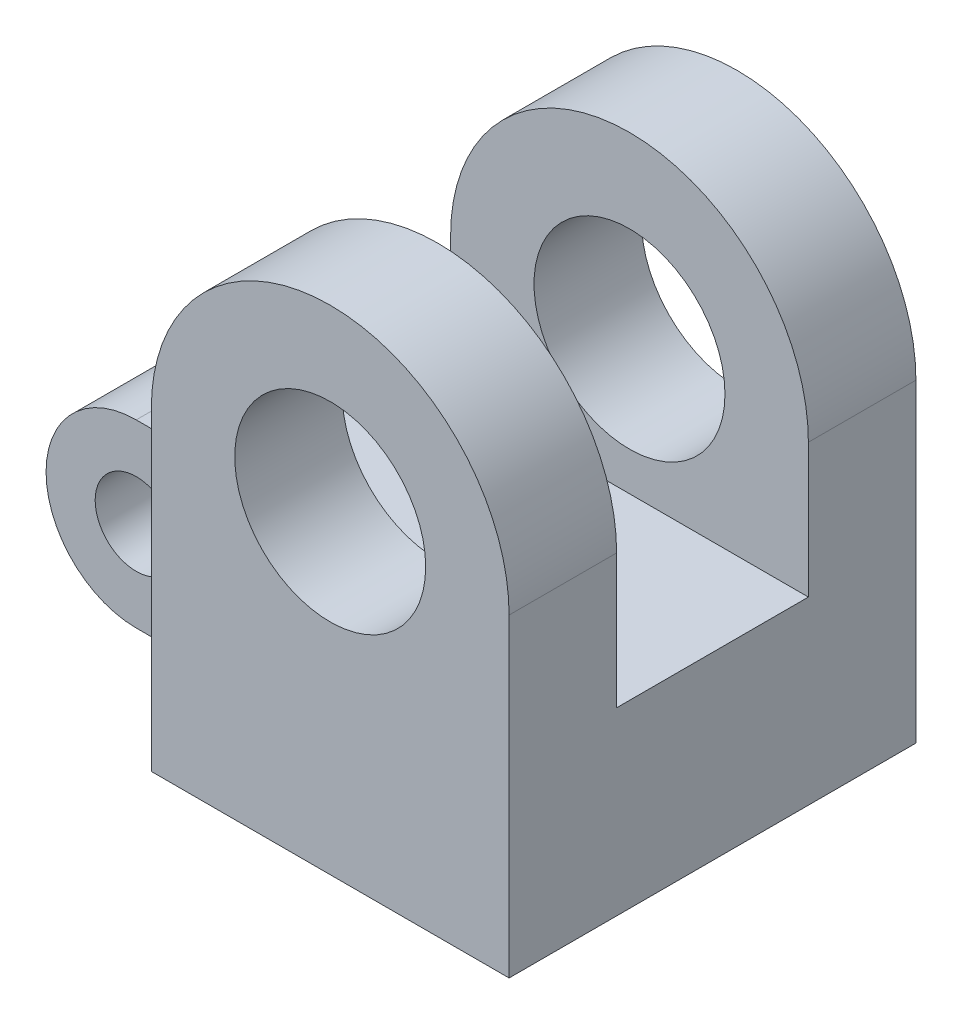
ISO-10303-21;
HEADER;
FILE_DESCRIPTION(('STEP AP214'),'2;1');
FILE_NAME('part.step','',(''),(''),'','','');
FILE_SCHEMA(('AUTOMOTIVE_DESIGN { 1 0 10303 214 1 1 1 1 }'));
ENDSEC;
DATA;
#1=APPLICATION_CONTEXT('core data for automotive mechanical design processes');
#2=APPLICATION_PROTOCOL_DEFINITION('international standard','automotive_design',2000,#1);
#3=PRODUCT_CONTEXT('',#1,'mechanical');
#4=PRODUCT('Part','Part','',(#3));
#5=PRODUCT_RELATED_PRODUCT_CATEGORY('part','',(#4));
#6=PRODUCT_DEFINITION_FORMATION('','',#4);
#7=PRODUCT_DEFINITION_CONTEXT('part definition',#1,'design');
#8=PRODUCT_DEFINITION('design','',#6,#7);
#9=PRODUCT_DEFINITION_SHAPE('','',#8);
#10=(LENGTH_UNIT() NAMED_UNIT(*) SI_UNIT(.MILLI.,.METRE.));
#11=(NAMED_UNIT(*) PLANE_ANGLE_UNIT() SI_UNIT($,.RADIAN.));
#12=(NAMED_UNIT(*) SI_UNIT($,.STERADIAN.) SOLID_ANGLE_UNIT());
#13=UNCERTAINTY_MEASURE_WITH_UNIT(LENGTH_MEASURE(1.E-05),#10,'distance_accuracy_value','');
#14=(GEOMETRIC_REPRESENTATION_CONTEXT(3) GLOBAL_UNCERTAINTY_ASSIGNED_CONTEXT((#13)) GLOBAL_UNIT_ASSIGNED_CONTEXT((#10,
#11,#12)) REPRESENTATION_CONTEXT('',''));
#15=CARTESIAN_POINT('',(0.,0.,0.));
#16=DIRECTION('',(0.,0.,1.));
#17=DIRECTION('',(1.,0.,0.));
#18=AXIS2_PLACEMENT_3D('',#15,#16,#17);
#19=CARTESIAN_POINT('',(-7.13852294254025,-12.543819339669,8.11692489830939));
#20=DIRECTION('',(1.,0.,0.));
#21=DIRECTION('',(0.,0.,-1.));
#22=AXIS2_PLACEMENT_3D('',#19,#20,#21);
#23=PLANE('',#22);
#24=DIRECTION('',(0.,-1.,0.));
#25=VECTOR('',#24,1.);
#26=CARTESIAN_POINT('',(-7.13852294254025,-12.543819339669,3.46247964587531));
#27=LINE('',#26,#25);
#28=CARTESIAN_POINT('',(-7.13852294254025,-5.35045843338366,3.46247964587531));
#29=VERTEX_POINT('',#28);
#30=CARTESIAN_POINT('',(-7.13852294254025,-12.543819339669,3.46247964587531));
#31=VERTEX_POINT('',#30);
#32=EDGE_CURVE('E56',#29,#31,#27,.T.);
#33=ORIENTED_EDGE('',*,*,#32,.T.);
#34=DIRECTION('',(0.,0.,-1.));
#35=VECTOR('',#34,1.);
#36=CARTESIAN_POINT('',(-7.13852294254025,-12.543819339669,8.11692489830939));
#37=LINE('',#36,#35);
#38=CARTESIAN_POINT('',(-7.13852294254025,-12.543819339669,8.11692489830939));
#39=VERTEX_POINT('',#38);
#40=EDGE_CURVE('E212',#39,#31,#37,.T.);
#41=ORIENTED_EDGE('',*,*,#40,.F.);
#42=DIRECTION('',(0.,-1.,0.));
#43=VECTOR('',#42,1.);
#44=CARTESIAN_POINT('',(-7.13852294254025,-12.543819339669,8.11692489830939));
#45=LINE('',#44,#43);
#46=CARTESIAN_POINT('',(-7.13852294254025,0.,8.11692489830939));
#47=VERTEX_POINT('',#46);
#48=EDGE_CURVE('E202',#47,#39,#45,.T.);
#49=ORIENTED_EDGE('',*,*,#48,.F.);
#50=DIRECTION('',(0.,0.,-1.));
#51=VECTOR('',#50,1.);
#52=CARTESIAN_POINT('',(-7.13852294254025,0.,8.11692489830939));
#53=LINE('',#52,#51);
#54=CARTESIAN_POINT('',(-7.13852294254025,0.,3.82567225106783));
#55=VERTEX_POINT('',#54);
#56=EDGE_CURVE('E215',#47,#55,#53,.T.);
#57=ORIENTED_EDGE('',*,*,#56,.T.);
#58=DIRECTION('',(0.,-1.,0.));
#59=VECTOR('',#58,1.);
#60=CARTESIAN_POINT('',(-7.13852294254025,-12.543819339669,3.82567225106783));
#61=LINE('',#60,#59);
#62=CARTESIAN_POINT('',(-7.13852294254025,-5.35045843338366,3.82567225106783));
#63=VERTEX_POINT('',#62);
#64=EDGE_CURVE('E224',#55,#63,#61,.T.);
#65=ORIENTED_EDGE('',*,*,#64,.T.);
#66=DIRECTION('',(0.,0.,-1.));
#67=VECTOR('',#66,1.);
#68=CARTESIAN_POINT('',(-7.13852294254025,-5.35045843338366,8.11692489830939));
#69=LINE('',#68,#67);
#70=EDGE_CURVE('E41',#63,#29,#69,.T.);
#71=ORIENTED_EDGE('',*,*,#70,.T.);
#72=EDGE_LOOP('',(#33,#41,#49,#57,#65,#71));
#73=FACE_BOUND('',#72,.T.);
#74=ADVANCED_FACE('F32',(#73),#23,.F.);
#75=CARTESIAN_POINT('',(7.13852294254025,0.,8.11692489830939));
#76=DIRECTION('',(-1.,0.,0.));
#77=DIRECTION('',(0.,0.,1.));
#78=AXIS2_PLACEMENT_3D('',#75,#76,#77);
#79=PLANE('',#78);
#80=DIRECTION('',(0.,1.,0.));
#81=VECTOR('',#80,1.);
#82=CARTESIAN_POINT('',(7.13852294254025,0.,-3.82567225106784));
#83=LINE('',#82,#81);
#84=CARTESIAN_POINT('',(7.13852294254025,-5.35045843338366,-3.82567225106783));
#85=VERTEX_POINT('',#84);
#86=CARTESIAN_POINT('',(7.13852294254025,0.,-3.82567225106784));
#87=VERTEX_POINT('',#86);
#88=EDGE_CURVE('E189',#85,#87,#83,.T.);
#89=ORIENTED_EDGE('',*,*,#88,.F.);
#90=DIRECTION('',(0.,0.,1.));
#91=VECTOR('',#90,1.);
#92=CARTESIAN_POINT('',(7.13852294254025,-5.35045843338366,8.11692489830939));
#93=LINE('',#92,#91);
#94=CARTESIAN_POINT('',(7.13852294254025,-5.35045843338366,3.82567225106783));
#95=VERTEX_POINT('',#94);
#96=EDGE_CURVE('E191',#85,#95,#93,.T.);
#97=ORIENTED_EDGE('',*,*,#96,.T.);
#98=DIRECTION('',(0.,1.,0.));
#99=VECTOR('',#98,1.);
#100=CARTESIAN_POINT('',(7.13852294254025,0.,3.82567225106783));
#101=LINE('',#100,#99);
#102=CARTESIAN_POINT('',(7.13852294254025,0.,3.82567225106783));
#103=VERTEX_POINT('',#102);
#104=EDGE_CURVE('E184',#95,#103,#101,.T.);
#105=ORIENTED_EDGE('',*,*,#104,.T.);
#106=DIRECTION('',(0.,0.,-1.));
#107=VECTOR('',#106,1.);
#108=CARTESIAN_POINT('',(7.13852294254025,0.,8.11692489830939));
#109=LINE('',#108,#107);
#110=CARTESIAN_POINT('',(7.13852294254025,0.,8.11692489830939));
#111=VERTEX_POINT('',#110);
#112=EDGE_CURVE('E219',#111,#103,#109,.T.);
#113=ORIENTED_EDGE('',*,*,#112,.F.);
#114=DIRECTION('',(0.,1.,0.));
#115=VECTOR('',#114,1.);
#116=CARTESIAN_POINT('',(7.13852294254025,0.,8.11692489830939));
#117=LINE('',#116,#115);
#118=CARTESIAN_POINT('',(7.13852294254025,-12.543819339669,8.11692489830939));
#119=VERTEX_POINT('',#118);
#120=EDGE_CURVE('E197',#119,#111,#117,.T.);
#121=ORIENTED_EDGE('',*,*,#120,.F.);
#122=DIRECTION('',(0.,0.,-1.));
#123=VECTOR('',#122,1.);
#124=CARTESIAN_POINT('',(7.13852294254025,-12.543819339669,8.11692489830939));
#125=LINE('',#124,#123);
#126=CARTESIAN_POINT('',(7.13852294254025,-12.543819339669,-8.11692489830939));
#127=VERTEX_POINT('',#126);
#128=EDGE_CURVE('E222',#119,#127,#125,.T.);
#129=ORIENTED_EDGE('',*,*,#128,.T.);
#130=DIRECTION('',(0.,1.,0.));
#131=VECTOR('',#130,1.);
#132=CARTESIAN_POINT('',(7.13852294254025,0.,-8.11692489830939));
#133=LINE('',#132,#131);
#134=CARTESIAN_POINT('',(7.13852294254025,0.,-8.11692489830939));
#135=VERTEX_POINT('',#134);
#136=EDGE_CURVE('E206',#127,#135,#133,.T.);
#137=ORIENTED_EDGE('',*,*,#136,.T.);
#138=EDGE_CURVE('E218',#87,#135,#109,.T.);
#139=ORIENTED_EDGE('',*,*,#138,.F.);
#140=EDGE_LOOP('',(#89,#97,#105,#113,#121,#129,#137,#139));
#141=FACE_BOUND('',#140,.T.);
#142=ADVANCED_FACE('F238',(#141),#79,.F.);
#143=CARTESIAN_POINT('',(0.,0.,8.11692489830939));
#144=DIRECTION('',(0.,0.,-1.));
#145=DIRECTION('',(-1.,0.,0.));
#146=AXIS2_PLACEMENT_3D('',#143,#144,#145);
#147=CYLINDRICAL_SURFACE('',#146,7.13852294254025);
#148=CARTESIAN_POINT('',(0.,0.,-3.82567225106784));
#149=DIRECTION('',(0.,0.,1.));
#150=DIRECTION('',(1.,0.,0.));
#151=AXIS2_PLACEMENT_3D('',#148,#149,#150);
#152=CIRCLE('',#151,7.13852294254025);
#153=CARTESIAN_POINT('',(-7.13852294254025,0.,-3.82567225106784));
#154=VERTEX_POINT('',#153);
#155=EDGE_CURVE('E187',#87,#154,#152,.T.);
#156=ORIENTED_EDGE('',*,*,#155,.F.);
#157=ORIENTED_EDGE('',*,*,#138,.T.);
#158=CARTESIAN_POINT('',(0.,0.,-8.11692489830939));
#159=DIRECTION('',(0.,0.,1.));
#160=DIRECTION('',(-1.,0.,0.));
#161=AXIS2_PLACEMENT_3D('',#158,#159,#160);
#162=CIRCLE('',#161,7.13852294254025);
#163=CARTESIAN_POINT('',(-7.13852294254025,0.,-8.11692489830939));
#164=VERTEX_POINT('',#163);
#165=EDGE_CURVE('E208',#135,#164,#162,.T.);
#166=ORIENTED_EDGE('',*,*,#165,.T.);
#167=EDGE_CURVE('E214',#154,#164,#53,.T.);
#168=ORIENTED_EDGE('',*,*,#167,.F.);
#169=EDGE_LOOP('',(#156,#157,#166,#168));
#170=FACE_BOUND('',#169,.T.);
#171=ADVANCED_FACE('F261',(#170),#147,.T.);
#172=CARTESIAN_POINT('',(-7.13852294254025,-12.543819339669,-3.46247964587531));
#173=VERTEX_POINT('',#172);
#174=CARTESIAN_POINT('',(-7.13852294254025,-12.543819339669,-8.11692489830939));
#175=VERTEX_POINT('',#174);
#176=EDGE_CURVE('E48',#173,#175,#37,.T.);
#177=ORIENTED_EDGE('',*,*,#176,.F.);
#178=DIRECTION('',(0.,-1.,0.));
#179=VECTOR('',#178,1.);
#180=CARTESIAN_POINT('',(-7.13852294254025,-12.543819339669,-3.46247964587531));
#181=LINE('',#180,#179);
#182=CARTESIAN_POINT('',(-7.13852294254025,-5.35045843338366,-3.46247964587531));
#183=VERTEX_POINT('',#182);
#184=EDGE_CURVE('E154',#183,#173,#181,.T.);
#185=ORIENTED_EDGE('',*,*,#184,.F.);
#186=CARTESIAN_POINT('',(-7.13852294254025,-5.35045843338366,-3.82567225106783));
#187=VERTEX_POINT('',#186);
#188=EDGE_CURVE('E227',#183,#187,#69,.T.);
#189=ORIENTED_EDGE('',*,*,#188,.T.);
#190=DIRECTION('',(0.,-1.,0.));
#191=VECTOR('',#190,1.);
#192=CARTESIAN_POINT('',(-7.13852294254025,-12.543819339669,-3.82567225106784));
#193=LINE('',#192,#191);
#194=EDGE_CURVE('E11',#154,#187,#193,.T.);
#195=ORIENTED_EDGE('',*,*,#194,.F.);
#196=ORIENTED_EDGE('',*,*,#167,.T.);
#197=DIRECTION('',(0.,-1.,0.));
#198=VECTOR('',#197,1.);
#199=CARTESIAN_POINT('',(-7.13852294254025,-12.543819339669,-8.11692489830939));
#200=LINE('',#199,#198);
#201=EDGE_CURVE('E198',#164,#175,#200,.T.);
#202=ORIENTED_EDGE('',*,*,#201,.T.);
#203=EDGE_LOOP('',(#177,#185,#189,#195,#196,#202));
#204=FACE_BOUND('',#203,.T.);
#205=ADVANCED_FACE('F229',(#204),#23,.F.);
#206=CARTESIAN_POINT('',(7.13852294254025,-12.543819339669,8.11692489830939));
#207=DIRECTION('',(0.,1.,0.));
#208=DIRECTION('',(-1.,0.,0.));
#209=AXIS2_PLACEMENT_3D('',#206,#207,#208);
#210=PLANE('',#209);
#211=CARTESIAN_POINT('',(0.,-12.543819339669,0.));
#212=DIRECTION('',(0.,-1.,0.));
#213=DIRECTION('',(1.,0.,0.));
#214=AXIS2_PLACEMENT_3D('',#211,#212,#213);
#215=CIRCLE('',#214,6.42500000000001);
#216=CARTESIAN_POINT('',(6.42500000000002,-12.543819339669,0.));
#217=VERTEX_POINT('',#216);
#218=EDGE_CURVE('E136',#217,#217,#215,.T.);
#219=ORIENTED_EDGE('',*,*,#218,.F.);
#220=EDGE_LOOP('',(#219));
#221=FACE_BOUND('',#220,.T.);
#222=DIRECTION('',(1.,0.,0.));
#223=VECTOR('',#222,1.);
#224=CARTESIAN_POINT('',(7.13852294254025,-12.543819339669,-8.11692489830939));
#225=LINE('',#224,#223);
#226=EDGE_CURVE('E193',#175,#127,#225,.T.);
#227=ORIENTED_EDGE('',*,*,#226,.T.);
#228=ORIENTED_EDGE('',*,*,#128,.F.);
#229=DIRECTION('',(1.,0.,0.));
#230=VECTOR('',#229,1.);
#231=CARTESIAN_POINT('',(7.13852294254025,-12.543819339669,8.11692489830939));
#232=LINE('',#231,#230);
#233=EDGE_CURVE('E194',#39,#119,#232,.T.);
#234=ORIENTED_EDGE('',*,*,#233,.F.);
#235=ORIENTED_EDGE('',*,*,#40,.T.);
#236=DIRECTION('',(-1.,0.,0.));
#237=VECTOR('',#236,1.);
#238=CARTESIAN_POINT('',(-12.3960083313648,-12.543819339669,3.46247964587531));
#239=LINE('',#238,#237);
#240=CARTESIAN_POINT('',(-12.3960083313648,-12.543819339669,3.46247964587531));
#241=VERTEX_POINT('',#240);
#242=EDGE_CURVE('E160',#31,#241,#239,.T.);
#243=ORIENTED_EDGE('',*,*,#242,.T.);
#244=DIRECTION('',(0.,0.,-1.));
#245=VECTOR('',#244,1.);
#246=CARTESIAN_POINT('',(-12.3960083313648,-12.543819339669,3.46247964587531));
#247=LINE('',#246,#245);
#248=CARTESIAN_POINT('',(-12.3960083313648,-12.543819339669,-3.46247964587531));
#249=VERTEX_POINT('',#248);
#250=EDGE_CURVE('E137',#241,#249,#247,.T.);
#251=ORIENTED_EDGE('',*,*,#250,.T.);
#252=DIRECTION('',(-1.,0.,0.));
#253=VECTOR('',#252,1.);
#254=CARTESIAN_POINT('',(-12.3960083313648,-12.543819339669,-3.46247964587531));
#255=LINE('',#254,#253);
#256=EDGE_CURVE('E151',#173,#249,#255,.T.);
#257=ORIENTED_EDGE('',*,*,#256,.F.);
#258=ORIENTED_EDGE('',*,*,#176,.T.);
#259=EDGE_LOOP('',(#227,#228,#234,#235,#243,#251,#257,#258));
#260=FACE_BOUND('',#259,.T.);
#261=ADVANCED_FACE('F34',(#221,#260),#210,.F.);
#262=ORIENTED_EDGE('',*,*,#112,.T.);
#263=CARTESIAN_POINT('',(0.,0.,3.82567225106783));
#264=DIRECTION('',(0.,0.,1.));
#265=DIRECTION('',(1.,0.,0.));
#266=AXIS2_PLACEMENT_3D('',#263,#264,#265);
#267=CIRCLE('',#266,7.13852294254025);
#268=EDGE_CURVE('E180',#103,#55,#267,.T.);
#269=ORIENTED_EDGE('',*,*,#268,.T.);
#270=ORIENTED_EDGE('',*,*,#56,.F.);
#271=CARTESIAN_POINT('',(0.,0.,8.11692489830939));
#272=DIRECTION('',(0.,0.,1.));
#273=DIRECTION('',(-1.,0.,0.));
#274=AXIS2_PLACEMENT_3D('',#271,#272,#273);
#275=CIRCLE('',#274,7.13852294254025);
#276=EDGE_CURVE('E200',#111,#47,#275,.T.);
#277=ORIENTED_EDGE('',*,*,#276,.F.);
#278=EDGE_LOOP('',(#262,#269,#270,#277));
#279=FACE_BOUND('',#278,.T.);
#280=ADVANCED_FACE('F245',(#279),#147,.T.);
#281=CARTESIAN_POINT('',(0.,0.,8.11692489830939));
#282=DIRECTION('',(0.,0.,-1.));
#283=DIRECTION('',(-1.,0.,0.));
#284=AXIS2_PLACEMENT_3D('',#281,#282,#283);
#285=PLANE('',#284);
#286=CARTESIAN_POINT('',(0.,0.,8.11692489830939));
#287=DIRECTION('',(0.,0.,1.));
#288=DIRECTION('',(1.,0.,0.));
#289=AXIS2_PLACEMENT_3D('',#286,#287,#288);
#290=CIRCLE('',#289,3.81);
#291=CARTESIAN_POINT('',(3.81,0.,8.11692489830939));
#292=VERTEX_POINT('',#291);
#293=EDGE_CURVE('E165',#292,#292,#290,.T.);
#294=ORIENTED_EDGE('',*,*,#293,.F.);
#295=EDGE_LOOP('',(#294));
#296=FACE_BOUND('',#295,.T.);
#297=ORIENTED_EDGE('',*,*,#233,.T.);
#298=ORIENTED_EDGE('',*,*,#120,.T.);
#299=ORIENTED_EDGE('',*,*,#276,.T.);
#300=ORIENTED_EDGE('',*,*,#48,.T.);
#301=EDGE_LOOP('',(#297,#298,#299,#300));
#302=FACE_BOUND('',#301,.T.);
#303=ADVANCED_FACE('F250',(#296,#302),#285,.F.);
#304=CARTESIAN_POINT('',(0.,0.,-8.11692489830939));
#305=DIRECTION('',(0.,0.,-1.));
#306=DIRECTION('',(-1.,0.,0.));
#307=AXIS2_PLACEMENT_3D('',#304,#305,#306);
#308=PLANE('',#307);
#309=CARTESIAN_POINT('',(0.,0.,-8.11692489830939));
#310=DIRECTION('',(0.,0.,1.));
#311=DIRECTION('',(1.,0.,0.));
#312=AXIS2_PLACEMENT_3D('',#309,#310,#311);
#313=CIRCLE('',#312,3.81);
#314=CARTESIAN_POINT('',(3.81,0.,-8.11692489830939));
#315=VERTEX_POINT('',#314);
#316=EDGE_CURVE('E168',#315,#315,#313,.T.);
#317=ORIENTED_EDGE('',*,*,#316,.T.);
#318=EDGE_LOOP('',(#317));
#319=FACE_BOUND('',#318,.T.);
#320=ORIENTED_EDGE('',*,*,#226,.F.);
#321=ORIENTED_EDGE('',*,*,#201,.F.);
#322=ORIENTED_EDGE('',*,*,#165,.F.);
#323=ORIENTED_EDGE('',*,*,#136,.F.);
#324=EDGE_LOOP('',(#320,#321,#322,#323));
#325=FACE_BOUND('',#324,.T.);
#326=ADVANCED_FACE('F258',(#319,#325),#308,.T.);
#327=CARTESIAN_POINT('',(-29.3671614102209,-5.35045843338366,-3.82567225106783));
#328=DIRECTION('',(0.,-1.,0.));
#329=DIRECTION('',(0.,0.,-1.));
#330=AXIS2_PLACEMENT_3D('',#327,#328,#329);
#331=PLANE('',#330);
#332=DIRECTION('',(1.,0.,0.));
#333=VECTOR('',#332,1.);
#334=CARTESIAN_POINT('',(-29.3671614102209,-5.35045843338366,3.82567225106783));
#335=LINE('',#334,#333);
#336=EDGE_CURVE('E176',#63,#95,#335,.T.);
#337=ORIENTED_EDGE('',*,*,#336,.T.);
#338=ORIENTED_EDGE('',*,*,#96,.F.);
#339=DIRECTION('',(1.,0.,0.));
#340=VECTOR('',#339,1.);
#341=CARTESIAN_POINT('',(-29.3671614102209,-5.35045843338366,-3.82567225106783));
#342=LINE('',#341,#340);
#343=EDGE_CURVE('E177',#187,#85,#342,.T.);
#344=ORIENTED_EDGE('',*,*,#343,.F.);
#345=ORIENTED_EDGE('',*,*,#188,.F.);
#346=DIRECTION('',(1.,0.,0.));
#347=VECTOR('',#346,1.);
#348=CARTESIAN_POINT('',(-7.13852294254025,-5.35045843338366,-3.46247964587531));
#349=LINE('',#348,#347);
#350=CARTESIAN_POINT('',(-12.3960083313648,-5.35045843338367,-3.46247964587531));
#351=VERTEX_POINT('',#350);
#352=EDGE_CURVE('E131',#351,#183,#349,.T.);
#353=ORIENTED_EDGE('',*,*,#352,.F.);
#354=DIRECTION('',(0.,0.,-1.));
#355=VECTOR('',#354,1.);
#356=CARTESIAN_POINT('',(-12.3960083313648,-5.35045843338367,3.46247964587531));
#357=LINE('',#356,#355);
#358=CARTESIAN_POINT('',(-12.3960083313648,-5.35045843338367,3.46247964587531));
#359=VERTEX_POINT('',#358);
#360=EDGE_CURVE('E124',#359,#351,#357,.T.);
#361=ORIENTED_EDGE('',*,*,#360,.F.);
#362=DIRECTION('',(1.,0.,0.));
#363=VECTOR('',#362,1.);
#364=CARTESIAN_POINT('',(-7.13852294254025,-5.35045843338366,3.46247964587531));
#365=LINE('',#364,#363);
#366=EDGE_CURVE('E129',#359,#29,#365,.T.);
#367=ORIENTED_EDGE('',*,*,#366,.T.);
#368=ORIENTED_EDGE('',*,*,#70,.F.);
#369=EDGE_LOOP('',(#337,#338,#344,#345,#353,#361,#367,#368));
#370=FACE_BOUND('',#369,.T.);
#371=ADVANCED_FACE('F127',(#370),#331,.F.);
#372=CARTESIAN_POINT('',(-29.3671614102209,-5.35045843338366,-3.82567225106783));
#373=DIRECTION('',(0.,0.,1.));
#374=DIRECTION('',(1.,0.,0.));
#375=AXIS2_PLACEMENT_3D('',#372,#373,#374);
#376=PLANE('',#375);
#377=CARTESIAN_POINT('',(0.,0.,-3.82567225106783));
#378=DIRECTION('',(0.,0.,1.));
#379=DIRECTION('',(1.,0.,0.));
#380=AXIS2_PLACEMENT_3D('',#377,#378,#379);
#381=CIRCLE('',#380,3.81);
#382=CARTESIAN_POINT('',(3.81,0.,-3.82567225106783));
#383=VERTEX_POINT('',#382);
#384=EDGE_CURVE('E173',#383,#383,#381,.T.);
#385=ORIENTED_EDGE('',*,*,#384,.F.);
#386=EDGE_LOOP('',(#385));
#387=FACE_BOUND('',#386,.T.);
#388=ORIENTED_EDGE('',*,*,#88,.T.);
#389=ORIENTED_EDGE('',*,*,#155,.T.);
#390=ORIENTED_EDGE('',*,*,#194,.T.);
#391=ORIENTED_EDGE('',*,*,#343,.T.);
#392=EDGE_LOOP('',(#388,#389,#390,#391));
#393=FACE_BOUND('',#392,.T.);
#394=ADVANCED_FACE('F233',(#387,#393),#376,.T.);
#395=CARTESIAN_POINT('',(-29.3671614102209,-5.35045843338366,3.82567225106783));
#396=DIRECTION('',(0.,0.,1.));
#397=DIRECTION('',(1.,0.,0.));
#398=AXIS2_PLACEMENT_3D('',#395,#396,#397);
#399=PLANE('',#398);
#400=CARTESIAN_POINT('',(0.,0.,3.82567225106784));
#401=DIRECTION('',(0.,0.,1.));
#402=DIRECTION('',(1.,0.,0.));
#403=AXIS2_PLACEMENT_3D('',#400,#401,#402);
#404=CIRCLE('',#403,3.81);
#405=CARTESIAN_POINT('',(3.81,0.,3.82567225106784));
#406=VERTEX_POINT('',#405);
#407=EDGE_CURVE('E36',#406,#406,#404,.T.);
#408=ORIENTED_EDGE('',*,*,#407,.T.);
#409=EDGE_LOOP('',(#408));
#410=FACE_BOUND('',#409,.T.);
#411=ORIENTED_EDGE('',*,*,#336,.F.);
#412=ORIENTED_EDGE('',*,*,#64,.F.);
#413=ORIENTED_EDGE('',*,*,#268,.F.);
#414=ORIENTED_EDGE('',*,*,#104,.F.);
#415=EDGE_LOOP('',(#411,#412,#413,#414));
#416=FACE_BOUND('',#415,.T.);
#417=ADVANCED_FACE('F242',(#410,#416),#399,.F.);
#418=CARTESIAN_POINT('',(0.,0.,-8.11692489830939));
#419=DIRECTION('',(0.,0.,1.));
#420=DIRECTION('',(1.,0.,0.));
#421=AXIS2_PLACEMENT_3D('',#418,#419,#420);
#422=CYLINDRICAL_SURFACE('',#421,3.81);
#423=ORIENTED_EDGE('',*,*,#293,.T.);
#424=EDGE_LOOP('',(#423));
#425=FACE_BOUND('',#424,.T.);
#426=ORIENTED_EDGE('',*,*,#407,.F.);
#427=EDGE_LOOP('',(#426));
#428=FACE_BOUND('',#427,.T.);
#429=ADVANCED_FACE('F284',(#425,#428),#422,.F.);
#430=ORIENTED_EDGE('',*,*,#384,.T.);
#431=EDGE_LOOP('',(#430));
#432=FACE_BOUND('',#431,.T.);
#433=ORIENTED_EDGE('',*,*,#316,.F.);
#434=EDGE_LOOP('',(#433));
#435=FACE_BOUND('',#434,.T.);
#436=ADVANCED_FACE('F289',(#432,#435),#422,.F.);
#437=CARTESIAN_POINT('',(0.,-11.273819339669,0.));
#438=DIRECTION('',(0.,-1.,0.));
#439=DIRECTION('',(1.,0.,0.));
#440=AXIS2_PLACEMENT_3D('',#437,#438,#439);
#441=CYLINDRICAL_SURFACE('',#440,6.42500000000001);
#442=CARTESIAN_POINT('',(0.,-11.273819339669,0.));
#443=DIRECTION('',(0.,-1.,0.));
#444=DIRECTION('',(1.,0.,0.));
#445=AXIS2_PLACEMENT_3D('',#442,#443,#444);
#446=CIRCLE('',#445,6.42500000000001);
#447=CARTESIAN_POINT('',(6.42500000000001,-11.273819339669,0.));
#448=VERTEX_POINT('',#447);
#449=EDGE_CURVE('E162',#448,#448,#446,.T.);
#450=ORIENTED_EDGE('',*,*,#449,.F.);
#451=EDGE_LOOP('',(#450));
#452=FACE_BOUND('',#451,.T.);
#453=ORIENTED_EDGE('',*,*,#218,.T.);
#454=EDGE_LOOP('',(#453));
#455=FACE_BOUND('',#454,.T.);
#456=ADVANCED_FACE('F292',(#452,#455),#441,.F.);
#457=CARTESIAN_POINT('',(0.,-11.273819339669,0.));
#458=DIRECTION('',(0.,-1.,0.));
#459=DIRECTION('',(1.,0.,0.));
#460=AXIS2_PLACEMENT_3D('',#457,#458,#459);
#461=PLANE('',#460);
#462=ORIENTED_EDGE('',*,*,#449,.T.);
#463=EDGE_LOOP('',(#462));
#464=FACE_BOUND('',#463,.T.);
#465=ADVANCED_FACE('F296',(#464),#461,.T.);
#466=CARTESIAN_POINT('',(-12.3960083313648,-8.94713888652632,3.46247964587531));
#467=DIRECTION('',(0.,0.,-1.));
#468=DIRECTION('',(-1.,0.,0.));
#469=AXIS2_PLACEMENT_3D('',#466,#467,#468);
#470=CYLINDRICAL_SURFACE('',#469,3.59668045314265);
#471=CARTESIAN_POINT('',(-12.3960083313648,-8.94713888652632,-3.46247964587531));
#472=DIRECTION('',(0.,0.,-1.));
#473=DIRECTION('',(1.,0.,0.));
#474=AXIS2_PLACEMENT_3D('',#471,#472,#473);
#475=CIRCLE('',#474,3.59668045314265);
#476=EDGE_CURVE('E159',#249,#351,#475,.T.);
#477=ORIENTED_EDGE('',*,*,#476,.F.);
#478=ORIENTED_EDGE('',*,*,#250,.F.);
#479=CARTESIAN_POINT('',(-12.3960083313648,-8.94713888652632,3.46247964587531));
#480=DIRECTION('',(0.,0.,-1.));
#481=DIRECTION('',(1.,0.,0.));
#482=AXIS2_PLACEMENT_3D('',#479,#480,#481);
#483=CIRCLE('',#482,3.59668045314265);
#484=EDGE_CURVE('E143',#241,#359,#483,.T.);
#485=ORIENTED_EDGE('',*,*,#484,.T.);
#486=ORIENTED_EDGE('',*,*,#360,.T.);
#487=EDGE_LOOP('',(#477,#478,#485,#486));
#488=FACE_BOUND('',#487,.T.);
#489=ADVANCED_FACE('F145',(#488),#470,.T.);
#490=CARTESIAN_POINT('',(-12.3960083313648,-8.94713888652632,3.46247964587531));
#491=DIRECTION('',(0.,0.,-1.));
#492=DIRECTION('',(1.,0.,0.));
#493=AXIS2_PLACEMENT_3D('',#490,#491,#492);
#494=PLANE('',#493);
#495=CARTESIAN_POINT('',(-12.3960083313648,-8.94713888652632,3.46247964587531));
#496=DIRECTION('',(0.,0.,-1.));
#497=DIRECTION('',(-1.,0.,0.));
#498=AXIS2_PLACEMENT_3D('',#495,#496,#497);
#499=CIRCLE('',#498,1.63838305542035);
#500=CARTESIAN_POINT('',(-14.0343913867851,-8.94713888652632,3.46247964587531));
#501=VERTEX_POINT('',#500);
#502=EDGE_CURVE('E155',#501,#501,#499,.T.);
#503=ORIENTED_EDGE('',*,*,#502,.T.);
#504=EDGE_LOOP('',(#503));
#505=FACE_BOUND('',#504,.T.);
#506=ORIENTED_EDGE('',*,*,#242,.F.);
#507=ORIENTED_EDGE('',*,*,#32,.F.);
#508=ORIENTED_EDGE('',*,*,#366,.F.);
#509=ORIENTED_EDGE('',*,*,#484,.F.);
#510=EDGE_LOOP('',(#506,#507,#508,#509));
#511=FACE_BOUND('',#510,.T.);
#512=ADVANCED_FACE('F142',(#505,#511),#494,.F.);
#513=CARTESIAN_POINT('',(-12.3960083313648,-8.94713888652632,-3.46247964587531));
#514=DIRECTION('',(0.,0.,-1.));
#515=DIRECTION('',(1.,0.,0.));
#516=AXIS2_PLACEMENT_3D('',#513,#514,#515);
#517=PLANE('',#516);
#518=CARTESIAN_POINT('',(-12.3960083313648,-8.94713888652632,-3.46247964587531));
#519=DIRECTION('',(0.,0.,-1.));
#520=DIRECTION('',(-1.,0.,0.));
#521=AXIS2_PLACEMENT_3D('',#518,#519,#520);
#522=CIRCLE('',#521,1.63838305542035);
#523=CARTESIAN_POINT('',(-14.0343913867851,-8.94713888652632,-3.46247964587531));
#524=VERTEX_POINT('',#523);
#525=EDGE_CURVE('E320',#524,#524,#522,.T.);
#526=ORIENTED_EDGE('',*,*,#525,.F.);
#527=EDGE_LOOP('',(#526));
#528=FACE_BOUND('',#527,.T.);
#529=ORIENTED_EDGE('',*,*,#256,.T.);
#530=ORIENTED_EDGE('',*,*,#476,.T.);
#531=ORIENTED_EDGE('',*,*,#352,.T.);
#532=ORIENTED_EDGE('',*,*,#184,.T.);
#533=EDGE_LOOP('',(#529,#530,#531,#532));
#534=FACE_BOUND('',#533,.T.);
#535=ADVANCED_FACE('F303',(#528,#534),#517,.T.);
#536=CARTESIAN_POINT('',(-12.3960083313648,-8.94713888652632,3.46247964587531));
#537=DIRECTION('',(0.,0.,-1.));
#538=DIRECTION('',(-1.,0.,0.));
#539=AXIS2_PLACEMENT_3D('',#536,#537,#538);
#540=CYLINDRICAL_SURFACE('',#539,1.63838305542035);
#541=ORIENTED_EDGE('',*,*,#502,.F.);
#542=EDGE_LOOP('',(#541));
#543=FACE_BOUND('',#542,.T.);
#544=ORIENTED_EDGE('',*,*,#525,.T.);
#545=EDGE_LOOP('',(#544));
#546=FACE_BOUND('',#545,.T.);
#547=ADVANCED_FACE('F306',(#543,#546),#540,.F.);
#548=CLOSED_SHELL('',(#74,#142,#171,#205,#261,#280,#303,#326,#371,#394,#417,#429,#436,#456,#465,
#489,#512,#535,#547));
#549=MANIFOLD_SOLID_BREP('B2',#548);
#550=ADVANCED_BREP_SHAPE_REPRESENTATION('',(#18,#549),#14);
#551=SHAPE_DEFINITION_REPRESENTATION(#9,#550);
ENDSEC;
END-ISO-10303-21;
